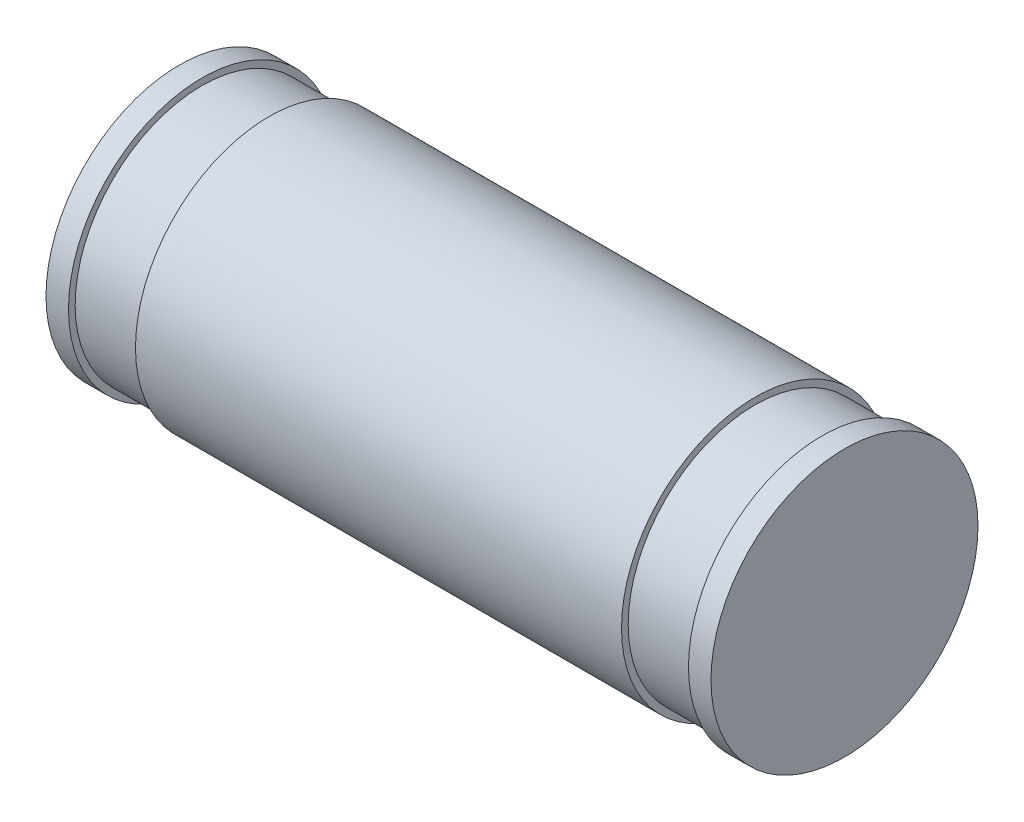
ISO-10303-21;
HEADER;
FILE_DESCRIPTION(('STEP AP214'),'2;1');
FILE_NAME('part.step','',(''),(''),'','','');
FILE_SCHEMA(('AUTOMOTIVE_DESIGN { 1 0 10303 214 1 1 1 1 }'));
ENDSEC;
DATA;
#1=APPLICATION_CONTEXT('core data for automotive mechanical design processes');
#2=APPLICATION_PROTOCOL_DEFINITION('international standard','automotive_design',2000,#1);
#3=PRODUCT_CONTEXT('',#1,'mechanical');
#4=PRODUCT('Part','Part','',(#3));
#5=PRODUCT_RELATED_PRODUCT_CATEGORY('part','',(#4));
#6=PRODUCT_DEFINITION_FORMATION('','',#4);
#7=PRODUCT_DEFINITION_CONTEXT('part definition',#1,'design');
#8=PRODUCT_DEFINITION('design','',#6,#7);
#9=PRODUCT_DEFINITION_SHAPE('','',#8);
#10=(LENGTH_UNIT() NAMED_UNIT(*) SI_UNIT(.MILLI.,.METRE.));
#11=(NAMED_UNIT(*) PLANE_ANGLE_UNIT() SI_UNIT($,.RADIAN.));
#12=(NAMED_UNIT(*) SI_UNIT($,.STERADIAN.) SOLID_ANGLE_UNIT());
#13=UNCERTAINTY_MEASURE_WITH_UNIT(LENGTH_MEASURE(1.E-05),#10,'distance_accuracy_value','');
#14=(GEOMETRIC_REPRESENTATION_CONTEXT(3) GLOBAL_UNCERTAINTY_ASSIGNED_CONTEXT((#13)) GLOBAL_UNIT_ASSIGNED_CONTEXT((#10,
#11,#12)) REPRESENTATION_CONTEXT('',''));
#15=CARTESIAN_POINT('',(0.,0.,0.));
#16=DIRECTION('',(0.,0.,1.));
#17=DIRECTION('',(1.,0.,0.));
#18=AXIS2_PLACEMENT_3D('',#15,#16,#17);
#19=CARTESIAN_POINT('',(12.0023053844026,0.,0.));
#20=DIRECTION('',(1.,0.,0.));
#21=DIRECTION('',(0.,0.,-1.));
#22=AXIS2_PLACEMENT_3D('',#19,#20,#21);
#23=CYLINDRICAL_SURFACE('',#22,4.);
#24=CARTESIAN_POINT('',(-11.049,0.,0.));
#25=DIRECTION('',(1.,0.,0.));
#26=DIRECTION('',(0.,0.,-1.));
#27=AXIS2_PLACEMENT_3D('',#24,#25,#26);
#28=CIRCLE('',#27,4.);
#29=CARTESIAN_POINT('',(-11.049,0.,-4.));
#30=VERTEX_POINT('',#29);
#31=EDGE_CURVE('E69',#30,#30,#28,.T.);
#32=ORIENTED_EDGE('',*,*,#31,.T.);
#33=EDGE_LOOP('',(#32));
#34=FACE_BOUND('',#33,.T.);
#35=CARTESIAN_POINT('',(-10.375,0.,0.));
#36=DIRECTION('',(1.,0.,0.));
#37=DIRECTION('',(0.,0.,-1.));
#38=AXIS2_PLACEMENT_3D('',#35,#36,#37);
#39=CIRCLE('',#38,4.);
#40=CARTESIAN_POINT('',(-10.375,0.,-4.));
#41=VERTEX_POINT('',#40);
#42=EDGE_CURVE('E10',#41,#41,#39,.T.);
#43=ORIENTED_EDGE('',*,*,#42,.F.);
#44=EDGE_LOOP('',(#43));
#45=FACE_BOUND('',#44,.T.);
#46=ADVANCED_FACE('F35',(#34,#45),#23,.T.);
#47=CARTESIAN_POINT('',(-10.375,0.,-4.));
#48=DIRECTION('',(1.,0.,0.));
#49=DIRECTION('',(0.,0.,-1.));
#50=AXIS2_PLACEMENT_3D('',#47,#48,#49);
#51=PLANE('',#50);
#52=ORIENTED_EDGE('',*,*,#42,.T.);
#53=EDGE_LOOP('',(#52));
#54=FACE_BOUND('',#53,.T.);
#55=CARTESIAN_POINT('',(-10.375,0.,0.));
#56=DIRECTION('',(1.,0.,0.));
#57=DIRECTION('',(0.,0.,-1.));
#58=AXIS2_PLACEMENT_3D('',#55,#56,#57);
#59=CIRCLE('',#58,3.8);
#60=CARTESIAN_POINT('',(-10.375,0.,-3.8));
#61=VERTEX_POINT('',#60);
#62=EDGE_CURVE('E41',#61,#61,#59,.T.);
#63=ORIENTED_EDGE('',*,*,#62,.F.);
#64=EDGE_LOOP('',(#63));
#65=FACE_BOUND('',#64,.T.);
#66=ADVANCED_FACE('F86',(#54,#65),#51,.T.);
#67=CARTESIAN_POINT('',(12.0023053844026,0.,0.));
#68=DIRECTION('',(1.,0.,0.));
#69=DIRECTION('',(0.,0.,-1.));
#70=AXIS2_PLACEMENT_3D('',#67,#68,#69);
#71=CYLINDRICAL_SURFACE('',#70,3.8);
#72=ORIENTED_EDGE('',*,*,#62,.T.);
#73=EDGE_LOOP('',(#72));
#74=FACE_BOUND('',#73,.T.);
#75=CARTESIAN_POINT('',(-8.3684,0.,0.));
#76=DIRECTION('',(1.,0.,0.));
#77=DIRECTION('',(0.,0.,-1.));
#78=AXIS2_PLACEMENT_3D('',#75,#76,#77);
#79=CIRCLE('',#78,3.8);
#80=CARTESIAN_POINT('',(-8.3684,0.,-3.8));
#81=VERTEX_POINT('',#80);
#82=EDGE_CURVE('E45',#81,#81,#79,.T.);
#83=ORIENTED_EDGE('',*,*,#82,.F.);
#84=EDGE_LOOP('',(#83));
#85=FACE_BOUND('',#84,.T.);
#86=ADVANCED_FACE('F90',(#74,#85),#71,.T.);
#87=CARTESIAN_POINT('',(-8.3684,0.,-3.8));
#88=DIRECTION('',(-1.,0.,0.));
#89=DIRECTION('',(0.,0.,1.));
#90=AXIS2_PLACEMENT_3D('',#87,#88,#89);
#91=PLANE('',#90);
#92=ORIENTED_EDGE('',*,*,#82,.T.);
#93=EDGE_LOOP('',(#92));
#94=FACE_BOUND('',#93,.T.);
#95=CARTESIAN_POINT('',(-8.3684,0.,0.));
#96=DIRECTION('',(1.,0.,0.));
#97=DIRECTION('',(0.,0.,-1.));
#98=AXIS2_PLACEMENT_3D('',#95,#96,#97);
#99=CIRCLE('',#98,4.);
#100=CARTESIAN_POINT('',(-8.3684,0.,-4.));
#101=VERTEX_POINT('',#100);
#102=EDGE_CURVE('E49',#101,#101,#99,.T.);
#103=ORIENTED_EDGE('',*,*,#102,.F.);
#104=EDGE_LOOP('',(#103));
#105=FACE_BOUND('',#104,.T.);
#106=ADVANCED_FACE('F94',(#94,#105),#91,.T.);
#107=CARTESIAN_POINT('',(12.0023053844026,0.,0.));
#108=DIRECTION('',(1.,0.,0.));
#109=DIRECTION('',(0.,0.,-1.));
#110=AXIS2_PLACEMENT_3D('',#107,#108,#109);
#111=CYLINDRICAL_SURFACE('',#110,4.);
#112=ORIENTED_EDGE('',*,*,#102,.T.);
#113=EDGE_LOOP('',(#112));
#114=FACE_BOUND('',#113,.T.);
#115=CARTESIAN_POINT('',(6.1934,0.,0.));
#116=DIRECTION('',(1.,0.,0.));
#117=DIRECTION('',(0.,0.,-1.));
#118=AXIS2_PLACEMENT_3D('',#115,#116,#117);
#119=CIRCLE('',#118,4.);
#120=CARTESIAN_POINT('',(6.1934,0.,-4.));
#121=VERTEX_POINT('',#120);
#122=EDGE_CURVE('E54',#121,#121,#119,.T.);
#123=ORIENTED_EDGE('',*,*,#122,.F.);
#124=EDGE_LOOP('',(#123));
#125=FACE_BOUND('',#124,.T.);
#126=ADVANCED_FACE('F100',(#114,#125),#111,.T.);
#127=CARTESIAN_POINT('',(6.1934,0.,-4.));
#128=DIRECTION('',(1.,0.,0.));
#129=DIRECTION('',(0.,0.,-1.));
#130=AXIS2_PLACEMENT_3D('',#127,#128,#129);
#131=PLANE('',#130);
#132=ORIENTED_EDGE('',*,*,#122,.T.);
#133=EDGE_LOOP('',(#132));
#134=FACE_BOUND('',#133,.T.);
#135=CARTESIAN_POINT('',(6.1934,0.,0.));
#136=DIRECTION('',(1.,0.,0.));
#137=DIRECTION('',(0.,0.,-1.));
#138=AXIS2_PLACEMENT_3D('',#135,#136,#137);
#139=CIRCLE('',#138,3.8);
#140=CARTESIAN_POINT('',(6.1934,0.,-3.8));
#141=VERTEX_POINT('',#140);
#142=EDGE_CURVE('E57',#141,#141,#139,.T.);
#143=ORIENTED_EDGE('',*,*,#142,.F.);
#144=EDGE_LOOP('',(#143));
#145=FACE_BOUND('',#144,.T.);
#146=ADVANCED_FACE('F104',(#134,#145),#131,.T.);
#147=CARTESIAN_POINT('',(12.0023053844026,0.,0.));
#148=DIRECTION('',(1.,0.,0.));
#149=DIRECTION('',(0.,0.,-1.));
#150=AXIS2_PLACEMENT_3D('',#147,#148,#149);
#151=CYLINDRICAL_SURFACE('',#150,3.8);
#152=ORIENTED_EDGE('',*,*,#142,.T.);
#153=EDGE_LOOP('',(#152));
#154=FACE_BOUND('',#153,.T.);
#155=CARTESIAN_POINT('',(8.2,0.,0.));
#156=DIRECTION('',(1.,0.,0.));
#157=DIRECTION('',(0.,0.,-1.));
#158=AXIS2_PLACEMENT_3D('',#155,#156,#157);
#159=CIRCLE('',#158,3.8);
#160=CARTESIAN_POINT('',(8.2,0.,-3.8));
#161=VERTEX_POINT('',#160);
#162=EDGE_CURVE('E60',#161,#161,#159,.T.);
#163=ORIENTED_EDGE('',*,*,#162,.F.);
#164=EDGE_LOOP('',(#163));
#165=FACE_BOUND('',#164,.T.);
#166=ADVANCED_FACE('F108',(#154,#165),#151,.T.);
#167=CARTESIAN_POINT('',(8.2,0.,-3.8));
#168=DIRECTION('',(-1.,0.,0.));
#169=DIRECTION('',(0.,0.,1.));
#170=AXIS2_PLACEMENT_3D('',#167,#168,#169);
#171=PLANE('',#170);
#172=ORIENTED_EDGE('',*,*,#162,.T.);
#173=EDGE_LOOP('',(#172));
#174=FACE_BOUND('',#173,.T.);
#175=CARTESIAN_POINT('',(8.2,0.,0.));
#176=DIRECTION('',(1.,0.,0.));
#177=DIRECTION('',(0.,0.,-1.));
#178=AXIS2_PLACEMENT_3D('',#175,#176,#177);
#179=CIRCLE('',#178,4.);
#180=CARTESIAN_POINT('',(8.2,0.,-4.));
#181=VERTEX_POINT('',#180);
#182=EDGE_CURVE('E63',#181,#181,#179,.T.);
#183=ORIENTED_EDGE('',*,*,#182,.F.);
#184=EDGE_LOOP('',(#183));
#185=FACE_BOUND('',#184,.T.);
#186=ADVANCED_FACE('F112',(#174,#185),#171,.T.);
#187=CARTESIAN_POINT('',(12.0023053844026,0.,0.));
#188=DIRECTION('',(1.,0.,0.));
#189=DIRECTION('',(0.,0.,-1.));
#190=AXIS2_PLACEMENT_3D('',#187,#188,#189);
#191=CYLINDRICAL_SURFACE('',#190,4.);
#192=ORIENTED_EDGE('',*,*,#182,.T.);
#193=EDGE_LOOP('',(#192));
#194=FACE_BOUND('',#193,.T.);
#195=CARTESIAN_POINT('',(8.874,0.,0.));
#196=DIRECTION('',(1.,0.,0.));
#197=DIRECTION('',(0.,0.,-1.));
#198=AXIS2_PLACEMENT_3D('',#195,#196,#197);
#199=CIRCLE('',#198,4.);
#200=CARTESIAN_POINT('',(8.874,0.,-4.));
#201=VERTEX_POINT('',#200);
#202=EDGE_CURVE('E66',#201,#201,#199,.T.);
#203=ORIENTED_EDGE('',*,*,#202,.F.);
#204=EDGE_LOOP('',(#203));
#205=FACE_BOUND('',#204,.T.);
#206=ADVANCED_FACE('F82',(#194,#205),#191,.T.);
#207=CARTESIAN_POINT('',(8.874,0.,0.));
#208=DIRECTION('',(1.,0.,0.));
#209=DIRECTION('',(0.,0.,-1.));
#210=AXIS2_PLACEMENT_3D('',#207,#208,#209);
#211=PLANE('',#210);
#212=ORIENTED_EDGE('',*,*,#202,.T.);
#213=EDGE_LOOP('',(#212));
#214=FACE_BOUND('',#213,.T.);
#215=ADVANCED_FACE('F77',(#214),#211,.T.);
#216=CARTESIAN_POINT('',(-11.049,0.,0.));
#217=DIRECTION('',(-1.,0.,0.));
#218=DIRECTION('',(0.,0.,1.));
#219=AXIS2_PLACEMENT_3D('',#216,#217,#218);
#220=PLANE('',#219);
#221=ORIENTED_EDGE('',*,*,#31,.F.);
#222=EDGE_LOOP('',(#221));
#223=FACE_BOUND('',#222,.T.);
#224=ADVANCED_FACE('F75',(#223),#220,.T.);
#225=CLOSED_SHELL('',(#46,#66,#86,#106,#126,#146,#166,#186,#206,#215,#224));
#226=MANIFOLD_SOLID_BREP('B2',#225);
#227=ADVANCED_BREP_SHAPE_REPRESENTATION('',(#18,#226),#14);
#228=SHAPE_DEFINITION_REPRESENTATION(#9,#227);
ENDSEC;
END-ISO-10303-21;
